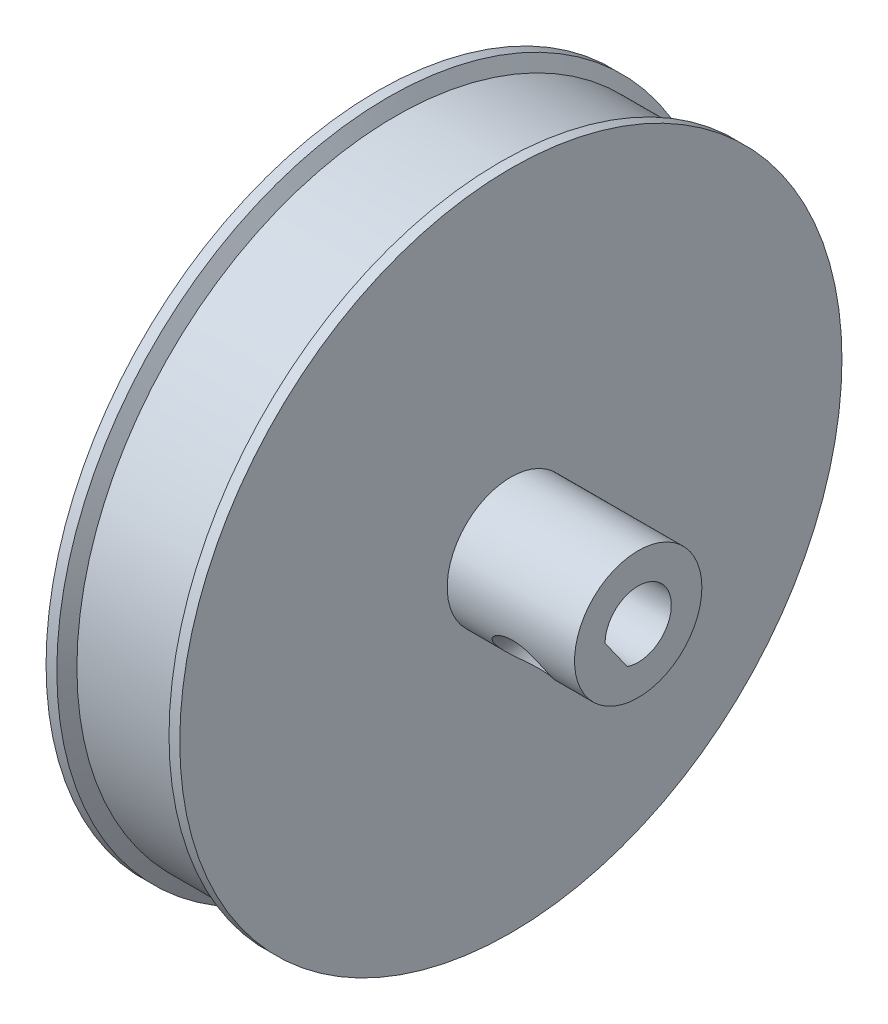
ISO-10303-21;
HEADER;
FILE_DESCRIPTION(('STEP AP214'),'2;1');
FILE_NAME('part.step','',(''),(''),'','','');
FILE_SCHEMA(('AUTOMOTIVE_DESIGN { 1 0 10303 214 1 1 1 1 }'));
ENDSEC;
DATA;
#1=APPLICATION_CONTEXT('core data for automotive mechanical design processes');
#2=APPLICATION_PROTOCOL_DEFINITION('international standard','automotive_design',2000,#1);
#3=PRODUCT_CONTEXT('',#1,'mechanical');
#4=PRODUCT('Part','Part','',(#3));
#5=PRODUCT_RELATED_PRODUCT_CATEGORY('part','',(#4));
#6=PRODUCT_DEFINITION_FORMATION('','',#4);
#7=PRODUCT_DEFINITION_CONTEXT('part definition',#1,'design');
#8=PRODUCT_DEFINITION('design','',#6,#7);
#9=PRODUCT_DEFINITION_SHAPE('','',#8);
#10=(LENGTH_UNIT() NAMED_UNIT(*) SI_UNIT(.MILLI.,.METRE.));
#11=(NAMED_UNIT(*) PLANE_ANGLE_UNIT() SI_UNIT($,.RADIAN.));
#12=(NAMED_UNIT(*) SI_UNIT($,.STERADIAN.) SOLID_ANGLE_UNIT());
#13=UNCERTAINTY_MEASURE_WITH_UNIT(LENGTH_MEASURE(1.E-05),#10,'distance_accuracy_value','');
#14=(GEOMETRIC_REPRESENTATION_CONTEXT(3) GLOBAL_UNCERTAINTY_ASSIGNED_CONTEXT((#13)) GLOBAL_UNIT_ASSIGNED_CONTEXT((#10,
#11,#12)) REPRESENTATION_CONTEXT('',''));
#15=CARTESIAN_POINT('',(0.,0.,0.));
#16=DIRECTION('',(0.,0.,1.));
#17=DIRECTION('',(1.,0.,0.));
#18=AXIS2_PLACEMENT_3D('',#15,#16,#17);
#19=CARTESIAN_POINT('',(-3.25,0.,0.));
#20=DIRECTION('',(1.,0.,0.));
#21=DIRECTION('',(0.,0.,-1.));
#22=AXIS2_PLACEMENT_3D('',#19,#20,#21);
#23=CYLINDRICAL_SURFACE('',#22,2.6);
#24=DIRECTION('',(1.,0.,0.));
#25=VECTOR('',#24,1.);
#26=CARTESIAN_POINT('',(-3.25,0.,2.6));
#27=LINE('',#26,#25);
#28=CARTESIAN_POINT('',(-5.25,0.,2.6));
#29=VERTEX_POINT('',#28);
#30=CARTESIAN_POINT('',(15.25,0.,2.6));
#31=VERTEX_POINT('',#30);
#32=EDGE_CURVE('E52',#29,#31,#27,.T.);
#33=ORIENTED_EDGE('',*,*,#32,.F.);
#34=CARTESIAN_POINT('',(-5.25,0.,0.));
#35=DIRECTION('',(-1.,0.,0.));
#36=DIRECTION('',(0.,0.,1.));
#37=AXIS2_PLACEMENT_3D('',#34,#35,#36);
#38=CIRCLE('',#37,2.6);
#39=CARTESIAN_POINT('',(-5.25,-2.45039545172254,0.869230769230768));
#40=VERTEX_POINT('',#39);
#41=EDGE_CURVE('E11',#29,#40,#38,.T.);
#42=ORIENTED_EDGE('',*,*,#41,.T.);
#43=DIRECTION('',(1.,0.,0.));
#44=VECTOR('',#43,1.);
#45=CARTESIAN_POINT('',(-3.25,-2.45039545172253,0.869230769230769));
#46=LINE('',#45,#44);
#47=CARTESIAN_POINT('',(15.25,-2.45039545172253,0.869230769230769));
#48=VERTEX_POINT('',#47);
#49=EDGE_CURVE('E48',#40,#48,#46,.T.);
#50=ORIENTED_EDGE('',*,*,#49,.T.);
#51=CARTESIAN_POINT('',(15.25,0.,0.));
#52=DIRECTION('',(1.,0.,0.));
#53=DIRECTION('',(0.,0.,-1.));
#54=AXIS2_PLACEMENT_3D('',#51,#52,#53);
#55=CIRCLE('',#54,2.6);
#56=EDGE_CURVE('E61',#48,#31,#55,.T.);
#57=ORIENTED_EDGE('',*,*,#56,.T.);
#58=EDGE_LOOP('',(#33,#42,#50,#57));
#59=FACE_BOUND('',#58,.T.);
#60=ADVANCED_FACE('F33',(#59),#23,.F.);
#61=CARTESIAN_POINT('',(-3.25,-2.45039545172253,0.869230769230769));
#62=DIRECTION('',(0.,-0.576923076923077,0.816798483907512));
#63=DIRECTION('',(0.,-0.816798483907512,-0.576923076923077));
#64=AXIS2_PLACEMENT_3D('',#61,#62,#63);
#65=PLANE('',#64);
#66=CARTESIAN_POINT('',(10.25,-1.22519772586127,1.73461538461538));
#67=DIRECTION('',(0.,-0.576923076923077,0.816798483907512));
#68=DIRECTION('',(0.,-0.816798483907512,-0.576923076923077));
#69=AXIS2_PLACEMENT_3D('',#66,#67,#68);
#70=CIRCLE('',#69,0.799999999999999);
#71=CARTESIAN_POINT('',(10.25,-1.87863651298728,1.27307692307692));
#72=VERTEX_POINT('',#71);
#73=EDGE_CURVE('E88',#72,#72,#70,.T.);
#74=ORIENTED_EDGE('',*,*,#73,.T.);
#75=EDGE_LOOP('',(#74));
#76=FACE_BOUND('',#75,.T.);
#77=ORIENTED_EDGE('',*,*,#49,.F.);
#78=DIRECTION('',(0.,0.816798483907512,0.576923076923077));
#79=VECTOR('',#78,1.);
#80=CARTESIAN_POINT('',(-5.25,-1.22519772586127,1.73461538461538));
#81=LINE('',#80,#79);
#82=EDGE_CURVE('E41',#40,#29,#81,.T.);
#83=ORIENTED_EDGE('',*,*,#82,.T.);
#84=ORIENTED_EDGE('',*,*,#32,.T.);
#85=DIRECTION('',(0.,-0.816798483907512,-0.576923076923077));
#86=VECTOR('',#85,1.);
#87=CARTESIAN_POINT('',(15.25,0.,2.6));
#88=LINE('',#87,#86);
#89=EDGE_CURVE('E90',#31,#48,#88,.T.);
#90=ORIENTED_EDGE('',*,*,#89,.T.);
#91=EDGE_LOOP('',(#77,#83,#84,#90));
#92=FACE_BOUND('',#91,.T.);
#93=ADVANCED_FACE('F65',(#76,#92),#65,.F.);
#94=CARTESIAN_POINT('',(5.25,0.,0.));
#95=DIRECTION('',(1.,0.,0.));
#96=DIRECTION('',(0.,0.,-1.));
#97=AXIS2_PLACEMENT_3D('',#94,#95,#96);
#98=PLANE('',#97);
#99=CARTESIAN_POINT('',(5.25,0.,0.));
#100=DIRECTION('',(1.,0.,0.));
#101=DIRECTION('',(0.,0.,-1.));
#102=AXIS2_PLACEMENT_3D('',#99,#100,#101);
#103=CIRCLE('',#102,26.);
#104=CARTESIAN_POINT('',(5.25,0.,-26.));
#105=VERTEX_POINT('',#104);
#106=EDGE_CURVE('E98',#105,#105,#103,.T.);
#107=ORIENTED_EDGE('',*,*,#106,.T.);
#108=EDGE_LOOP('',(#107));
#109=FACE_BOUND('',#108,.T.);
#110=CARTESIAN_POINT('',(5.25,0.,0.));
#111=DIRECTION('',(1.,0.,0.));
#112=DIRECTION('',(0.,0.,-1.));
#113=AXIS2_PLACEMENT_3D('',#110,#111,#112);
#114=CIRCLE('',#113,5.);
#115=CARTESIAN_POINT('',(5.25,0.,-5.));
#116=VERTEX_POINT('',#115);
#117=EDGE_CURVE('E92',#116,#116,#114,.T.);
#118=ORIENTED_EDGE('',*,*,#117,.F.);
#119=EDGE_LOOP('',(#118));
#120=FACE_BOUND('',#119,.T.);
#121=ADVANCED_FACE('F144',(#109,#120),#98,.T.);
#122=CARTESIAN_POINT('',(-3.25,0.,0.));
#123=DIRECTION('',(1.,0.,0.));
#124=DIRECTION('',(0.,0.,-1.));
#125=AXIS2_PLACEMENT_3D('',#122,#123,#124);
#126=CYLINDRICAL_SURFACE('',#125,25.);
#127=CARTESIAN_POINT('',(-3.82735026918964,0.,0.));
#128=DIRECTION('',(1.,0.,0.));
#129=DIRECTION('',(0.,0.,-1.));
#130=AXIS2_PLACEMENT_3D('',#127,#128,#129);
#131=CIRCLE('',#130,25.);
#132=CARTESIAN_POINT('',(-3.82735026918964,0.,-25.));
#133=VERTEX_POINT('',#132);
#134=EDGE_CURVE('E80',#133,#133,#131,.F.);
#135=CARTESIAN_POINT('',(3.82735026918964,0.,0.));
#136=DIRECTION('',(1.,0.,0.));
#137=DIRECTION('',(0.,0.,-1.));
#138=AXIS2_PLACEMENT_3D('',#135,#136,#137);
#139=CIRCLE('',#138,25.);
#140=CARTESIAN_POINT('',(3.82735026918964,0.,-25.));
#141=VERTEX_POINT('',#140);
#142=EDGE_CURVE('E67',#141,#141,#139,.F.);
#143=CARTESIAN_POINT('',(-3.82735026918964,0.,-25.));
#144=CARTESIAN_POINT('',(-3.74761380524819,0.,-25.));
#145=CARTESIAN_POINT('',(-3.66787734130674,0.,-25.));
#146=CARTESIAN_POINT('',(-3.50840441342384,0.,-25.));
#147=CARTESIAN_POINT('',(-3.42866794948239,0.,-25.));
#148=CARTESIAN_POINT('',(-3.26919502159948,0.,-25.));
#149=CARTESIAN_POINT('',(-3.18945855765803,0.,-25.));
#150=CARTESIAN_POINT('',(-3.02998562977513,0.,-25.));
#151=CARTESIAN_POINT('',(-2.95024916583368,0.,-25.));
#152=CARTESIAN_POINT('',(-2.79077623795078,0.,-25.));
#153=CARTESIAN_POINT('',(-2.71103977400933,0.,-25.));
#154=CARTESIAN_POINT('',(-2.55156684612643,0.,-25.));
#155=CARTESIAN_POINT('',(-2.47183038218498,0.,-25.));
#156=CARTESIAN_POINT('',(-2.31235745430207,0.,-25.));
#157=CARTESIAN_POINT('',(-2.23262099036062,0.,-25.));
#158=CARTESIAN_POINT('',(-2.07314806247772,0.,-25.));
#159=CARTESIAN_POINT('',(-1.99341159853627,0.,-25.));
#160=CARTESIAN_POINT('',(-1.83393867065337,0.,-25.));
#161=CARTESIAN_POINT('',(-1.75420220671192,0.,-25.));
#162=CARTESIAN_POINT('',(-1.59472927882902,0.,-25.));
#163=CARTESIAN_POINT('',(-1.51499281488757,0.,-25.));
#164=CARTESIAN_POINT('',(-1.35551988700466,0.,-25.));
#165=CARTESIAN_POINT('',(-1.27578342306321,0.,-25.));
#166=CARTESIAN_POINT('',(-1.11631049518031,0.,-25.));
#167=CARTESIAN_POINT('',(-1.03657403123886,0.,-25.));
#168=CARTESIAN_POINT('',(-0.877101103355959,0.,-25.));
#169=CARTESIAN_POINT('',(-0.797364639414509,0.,-25.));
#170=CARTESIAN_POINT('',(-0.637891711531607,0.,-25.));
#171=CARTESIAN_POINT('',(-0.558155247590156,0.,-25.));
#172=CARTESIAN_POINT('',(-0.398682319707255,0.,-25.));
#173=CARTESIAN_POINT('',(-0.318945855765804,0.,-25.));
#174=CARTESIAN_POINT('',(-0.159472927882902,0.,-25.));
#175=CARTESIAN_POINT('',(-0.0797364639414512,0.,-25.));
#176=CARTESIAN_POINT('',(0.0797364639414505,0.,-25.));
#177=CARTESIAN_POINT('',(0.159472927882901,0.,-25.));
#178=CARTESIAN_POINT('',(0.318945855765803,0.,-25.));
#179=CARTESIAN_POINT('',(0.398682319707254,0.,-25.));
#180=CARTESIAN_POINT('',(0.558155247590155,0.,-25.));
#181=CARTESIAN_POINT('',(0.637891711531606,0.,-25.));
#182=CARTESIAN_POINT('',(0.797364639414507,0.,-25.));
#183=CARTESIAN_POINT('',(0.877101103355958,0.,-25.));
#184=CARTESIAN_POINT('',(1.03657403123886,0.,-25.));
#185=CARTESIAN_POINT('',(1.11631049518031,0.,-25.));
#186=CARTESIAN_POINT('',(1.27578342306321,0.,-25.));
#187=CARTESIAN_POINT('',(1.35551988700466,0.,-25.));
#188=CARTESIAN_POINT('',(1.51499281488756,0.,-25.));
#189=CARTESIAN_POINT('',(1.59472927882902,0.,-25.));
#190=CARTESIAN_POINT('',(1.75420220671192,0.,-25.));
#191=CARTESIAN_POINT('',(1.83393867065337,0.,-25.));
#192=CARTESIAN_POINT('',(1.99341159853627,0.,-25.));
#193=CARTESIAN_POINT('',(2.07314806247772,0.,-25.));
#194=CARTESIAN_POINT('',(2.23262099036062,0.,-25.));
#195=CARTESIAN_POINT('',(2.31235745430207,0.,-25.));
#196=CARTESIAN_POINT('',(2.47183038218497,0.,-25.));
#197=CARTESIAN_POINT('',(2.55156684612643,0.,-25.));
#198=CARTESIAN_POINT('',(2.71103977400933,0.,-25.));
#199=CARTESIAN_POINT('',(2.79077623795078,0.,-25.));
#200=CARTESIAN_POINT('',(2.95024916583368,0.,-25.));
#201=CARTESIAN_POINT('',(3.02998562977513,0.,-25.));
#202=CARTESIAN_POINT('',(3.18945855765803,0.,-25.));
#203=CARTESIAN_POINT('',(3.26919502159948,0.,-25.));
#204=CARTESIAN_POINT('',(3.42866794948238,0.,-25.));
#205=CARTESIAN_POINT('',(3.50840441342384,0.,-25.));
#206=CARTESIAN_POINT('',(3.66787734130674,0.,-25.));
#207=CARTESIAN_POINT('',(3.74761380524819,0.,-25.));
#208=CARTESIAN_POINT('',(3.82735026918964,0.,-25.));
#209=B_SPLINE_CURVE_WITH_KNOTS('',3,(#143,#144,#145,#146,#147,#148,#149,#150,#151,#152,#153,
#154,#155,#156,#157,#158,#159,#160,#161,#162,#163,#164,#165,#166,#167,#168,#169,#170,#171,#172,
#173,#174,#175,#176,#177,#178,#179,#180,#181,#182,#183,#184,#185,#186,#187,#188,#189,#190,#191,
#192,#193,#194,#195,#196,#197,#198,#199,#200,#201,#202,#203,#204,#205,#206,#207,#208),
.UNSPECIFIED.,.F.,.F.,(4,2,2,2,2,2,2,2,2,2,2,2,2,2,2,2,2,2,2,2,2,2,2,2,2,2,2,2,2,2,2,2,4),(0.,
0.239209391824353,0.478418783648705,0.717628175473057,0.95683756729741,1.19604695912176,
1.43525635094611,1.67446574277047,1.91367513459482,2.15288452641917,2.39209391824352,
2.63130331006788,2.87051270189223,3.10972209371658,3.34893148554093,3.58814087736529,
3.82735026918964,4.06655966101399,4.30576905283834,4.5449784446627,4.78418783648705,
5.0233972283114,5.26260662013575,5.50181601196011,5.74102540378446,5.98023479560881,
6.21944418743316,6.45865357925751,6.69786297108187,6.93707236290622,7.17628175473057,
7.41549114655492,7.65470053837928),.UNSPECIFIED.);
#210=EDGE_CURVE('BSEAM135',#133,#141,#209,.T.);
#211=ORIENTED_EDGE('',*,*,#134,.F.);
#212=ORIENTED_EDGE('',*,*,#142,.T.);
#213=ORIENTED_EDGE('',*,*,#210,.T.);
#214=ORIENTED_EDGE('',*,*,#210,.F.);
#215=EDGE_LOOP('',(#211,#213,#212,#214));
#216=FACE_BOUND('',#215,.T.);
#217=ADVANCED_FACE('F135',(#216),#126,.T.);
#218=CARTESIAN_POINT('',(5.25,0.,0.));
#219=DIRECTION('',(-1.,0.,0.));
#220=DIRECTION('',(0.,0.,1.));
#221=AXIS2_PLACEMENT_3D('',#218,#219,#220);
#222=CYLINDRICAL_SURFACE('',#221,26.);
#223=CARTESIAN_POINT('',(4.40470053837927,0.,0.));
#224=DIRECTION('',(1.,0.,0.));
#225=DIRECTION('',(0.,0.,-1.));
#226=AXIS2_PLACEMENT_3D('',#223,#224,#225);
#227=CIRCLE('',#226,26.);
#228=CARTESIAN_POINT('',(4.40470053837927,0.,-26.));
#229=VERTEX_POINT('',#228);
#230=EDGE_CURVE('E109',#229,#229,#227,.T.);
#231=ORIENTED_EDGE('',*,*,#230,.T.);
#232=EDGE_LOOP('',(#231));
#233=FACE_BOUND('',#232,.T.);
#234=ORIENTED_EDGE('',*,*,#106,.F.);
#235=EDGE_LOOP('',(#234));
#236=FACE_BOUND('',#235,.T.);
#237=ADVANCED_FACE('F128',(#233,#236),#222,.T.);
#238=CARTESIAN_POINT('',(15.25,0.,0.));
#239=DIRECTION('',(1.,0.,0.));
#240=DIRECTION('',(0.,0.,-1.));
#241=AXIS2_PLACEMENT_3D('',#238,#239,#240);
#242=PLANE('',#241);
#243=CARTESIAN_POINT('',(15.25,0.,0.));
#244=DIRECTION('',(1.,0.,0.));
#245=DIRECTION('',(0.,0.,-1.));
#246=AXIS2_PLACEMENT_3D('',#243,#244,#245);
#247=CIRCLE('',#246,5.);
#248=CARTESIAN_POINT('',(15.25,0.,-5.));
#249=VERTEX_POINT('',#248);
#250=EDGE_CURVE('E63',#249,#249,#247,.T.);
#251=ORIENTED_EDGE('',*,*,#250,.T.);
#252=EDGE_LOOP('',(#251));
#253=FACE_BOUND('',#252,.T.);
#254=ORIENTED_EDGE('',*,*,#89,.F.);
#255=ORIENTED_EDGE('',*,*,#56,.F.);
#256=EDGE_LOOP('',(#254,#255));
#257=FACE_BOUND('',#256,.T.);
#258=ADVANCED_FACE('F126',(#253,#257),#242,.T.);
#259=CARTESIAN_POINT('',(15.25,0.,0.));
#260=DIRECTION('',(-1.,0.,0.));
#261=DIRECTION('',(0.,0.,1.));
#262=AXIS2_PLACEMENT_3D('',#259,#260,#261);
#263=CYLINDRICAL_SURFACE('',#262,5.);
#264=CARTESIAN_POINT('',(8.94414859613843,-3.96553531662124,3.04541126665864));
#265=CARTESIAN_POINT('',(8.84284625375276,-3.92526973026726,3.09784461359848));
#266=CARTESIAN_POINT('',(8.74665041923198,-3.87909697339447,3.15583479240154));
#267=CARTESIAN_POINT('',(8.56786733207601,-3.77399377758463,3.28079491307994));
#268=CARTESIAN_POINT('',(8.48528105112917,-3.71506242841017,3.34776549551521));
#269=CARTESIAN_POINT('',(8.35371418337194,-3.59792342934822,3.47284053244815));
#270=CARTESIAN_POINT('',(8.30132575594326,-3.54228211871936,3.52975724367155));
#271=CARTESIAN_POINT('',(8.20980588014393,-3.42285472337419,3.64567785205998));
#272=CARTESIAN_POINT('',(8.1706616848005,-3.35907655191909,3.70467968162515));
#273=CARTESIAN_POINT('',(8.10766905188448,-3.22368109124507,3.82308904413848));
#274=CARTESIAN_POINT('',(8.08393299189263,-3.15201057113535,3.88249643335815));
#275=CARTESIAN_POINT('',(8.05402469893131,-3.00313871488491,3.99875583460571));
#276=CARTESIAN_POINT('',(8.04784126996629,-2.92594093655721,4.05560945277371));
#277=CARTESIAN_POINT('',(8.05317383051586,-2.77814952879757,4.15800560351234));
#278=CARTESIAN_POINT('',(8.06268849242472,-2.70785072126411,4.20409135754902));
#279=CARTESIAN_POINT('',(8.09511088635928,-2.56731856800065,4.2913538321258));
#280=CARTESIAN_POINT('',(8.11801952111226,-2.49708522700255,4.33253022155921));
#281=CARTESIAN_POINT('',(8.17598574242927,-2.35855411258574,4.40948137084261));
#282=CARTESIAN_POINT('',(8.21106829585812,-2.29026063135243,4.44524481138815));
#283=CARTESIAN_POINT('',(8.29174404472393,-2.15734855080227,4.51124850741991));
#284=CARTESIAN_POINT('',(8.33734091970078,-2.09273124787516,4.54148682270513));
#285=CARTESIAN_POINT('',(8.44446949396239,-1.95961955385501,4.60064343432608));
#286=CARTESIAN_POINT('',(8.50734040832366,-1.89185813104053,4.62877788703081));
#287=CARTESIAN_POINT('',(8.64250448698617,-1.76394505702008,4.67902008353833));
#288=CARTESIAN_POINT('',(8.71480378921378,-1.70379841378466,4.7011238721093));
#289=CARTESIAN_POINT('',(8.88148416800947,-1.58146510808047,4.74383098295936));
#290=CARTESIAN_POINT('',(8.97745173484352,-1.52105843065361,4.76335303223131));
#291=CARTESIAN_POINT('',(9.17760540656271,-1.41368878385227,4.79631530897199));
#292=CARTESIAN_POINT('',(9.28179639389761,-1.36673387889001,4.80975189096131));
#293=CARTESIAN_POINT('',(9.51084835560727,-1.28194795760774,4.83309631124301));
#294=CARTESIAN_POINT('',(9.63658301132327,-1.2462552922954,4.84226619857091));
#295=CARTESIAN_POINT('',(9.89235827971712,-1.195028614202,4.85516299211019));
#296=CARTESIAN_POINT('',(10.0223993358791,-1.17949668428685,4.8588893359378));
#297=CARTESIAN_POINT('',(10.2878313613667,-1.16904416230067,4.86141706891306));
#298=CARTESIAN_POINT('',(10.4232532524279,-1.17484630261953,4.86004574789626));
#299=CARTESIAN_POINT('',(10.6911781122714,-1.20843741250213,4.85180056116464));
#300=CARTESIAN_POINT('',(10.8236807052695,-1.23622919586381,4.84492599125196));
#301=CARTESIAN_POINT('',(11.081979977196,-1.3126521378385,4.82477948265657));
#302=CARTESIAN_POINT('',(11.2077787479509,-1.36127675256121,4.81150955268461));
#303=CARTESIAN_POINT('',(11.4491506228132,-1.47774361823909,4.77702335465331));
#304=CARTESIAN_POINT('',(11.5647152531907,-1.54560160247539,4.75580057640778));
#305=CARTESIAN_POINT('',(11.7796646076641,-1.69720404980518,4.70380898742196));
#306=CARTESIAN_POINT('',(11.8792836063552,-1.78066971421268,4.67320244497986));
#307=CARTESIAN_POINT('',(12.0596356348946,-1.961592039387,4.60017220456813));
#308=CARTESIAN_POINT('',(12.1404185152914,-2.05901064283352,4.55778036484242));
#309=CARTESIAN_POINT('',(12.255174552387,-2.23078563888456,4.47543520350219));
#310=CARTESIAN_POINT('',(12.2958405671288,-2.30243731845141,4.43911081940339));
#311=CARTESIAN_POINT('',(12.3638902341633,-2.44856258178543,4.36020733565788));
#312=CARTESIAN_POINT('',(12.3912861803046,-2.52303348448542,4.31763407302736));
#313=CARTESIAN_POINT('',(12.4312220742302,-2.67290118989549,4.22650210095668));
#314=CARTESIAN_POINT('',(12.4436853819863,-2.74830077947737,4.17791391370633));
#315=CARTESIAN_POINT('',(12.4525846991196,-2.89697996330596,4.07622476573014));
#316=CARTESIAN_POINT('',(12.4490236275007,-2.97025994121403,4.02312462863079));
#317=CARTESIAN_POINT('',(12.4270977188367,-3.10644227959682,3.91877311473853));
#318=CARTESIAN_POINT('',(12.4099625985793,-3.16970371708535,3.86772357213372));
#319=CARTESIAN_POINT('',(12.363433247638,-3.29100448121444,3.76505112513287));
#320=CARTESIAN_POINT('',(12.3340368644131,-3.34904288874346,3.71342812161188));
#321=CARTESIAN_POINT('',(12.2627142841719,-3.46181093247826,3.60861289626759));
#322=CARTESIAN_POINT('',(12.2202424288052,-3.5162369597558,3.55546855702983));
#323=CARTESIAN_POINT('',(12.1251936260951,-3.61817158613689,3.45168598028309));
#324=CARTESIAN_POINT('',(12.0726121459471,-3.66567706544998,3.40104887978827));
#325=CARTESIAN_POINT('',(11.9496629581162,-3.76111747038132,3.29543087362051));
#326=CARTESIAN_POINT('',(11.8777923011206,-3.80783806207905,3.24110523330198));
#327=CARTESIAN_POINT('',(11.7248698567663,-3.89249615257863,3.13893026762325));
#328=CARTESIAN_POINT('',(11.6438116618749,-3.9304274647716,3.09108551381858));
#329=CARTESIAN_POINT('',(11.4586856938721,-4.00432305101703,2.99495123327787));
#330=CARTESIAN_POINT('',(11.3531373438668,-4.03862070154044,2.94822178812641));
#331=CARTESIAN_POINT('',(11.1345394547341,-4.09643678222325,2.86734694910753));
#332=CARTESIAN_POINT('',(11.021487002062,-4.11995099724707,2.83320647716197));
#333=CARTESIAN_POINT('',(10.7780180106719,-4.15874129666123,2.77600654059423));
#334=CARTESIAN_POINT('',(10.6470401741762,-4.17286219740914,2.75452983870511));
#335=CARTESIAN_POINT('',(10.3825849059119,-4.18897381126888,2.72996636329856));
#336=CARTESIAN_POINT('',(10.249106363793,-4.190959001456,2.72688796280599));
#337=CARTESIAN_POINT('',(9.9813524274109,-4.18278518580502,2.73940953104118));
#338=CARTESIAN_POINT('',(9.84709632544987,-4.17243902752201,2.75529735533668));
#339=CARTESIAN_POINT('',(9.58381035969653,-4.13899569932827,2.80528290212423));
#340=CARTESIAN_POINT('',(9.45477282890593,-4.11591802322592,2.83935278264232));
#341=CARTESIAN_POINT('',(9.2629182238128,-4.07007791443693,2.9043455085753));
#342=CARTESIAN_POINT('',(9.19693176594587,-4.05204879754166,2.92951342043038));
#343=CARTESIAN_POINT('',(9.06806110374705,-4.01190731260229,2.98425119039467));
#344=CARTESIAN_POINT('',(9.00517815768603,-3.98979330535841,3.01382281471516));
#345=CARTESIAN_POINT('',(8.94414859613843,-3.96553531662124,3.04541126665864));
#346=B_SPLINE_CURVE_WITH_KNOTS('',3,(#264,#265,#266,#267,#268,#269,#270,#271,#272,#273,#274,
#275,#276,#277,#278,#279,#280,#281,#282,#283,#284,#285,#286,#287,#288,#289,#290,#291,#292,#293,
#294,#295,#296,#297,#298,#299,#300,#301,#302,#303,#304,#305,#306,#307,#308,#309,#310,#311,#312,
#313,#314,#315,#316,#317,#318,#319,#320,#321,#322,#323,#324,#325,#326,#327,#328,#329,#330,#331,
#332,#333,#334,#335,#336,#337,#338,#339,#340,#341,#342,#343,#344,#345),.UNSPECIFIED.,.T.,.F.,(4,
2,2,2,2,2,2,2,2,2,2,2,2,2,2,2,2,2,2,2,2,2,2,2,2,2,2,2,2,2,2,2,2,2,2,2,2,2,2,2,4),(0.,
0.362651958749141,0.725329798740519,1.01006383632184,1.29452304553178,1.58103428698043,
1.86736273531021,2.11992392091748,2.37250213061158,2.62560143169093,2.87878944093167,
3.16758823640632,3.45657598872167,3.8004199486593,4.14446961564128,4.53576481090769,
4.92710042883526,5.33181354739167,5.73657846147493,6.1412163262175,6.54618615289328,
6.94451426537204,7.34177590780631,7.61081952831204,7.87961341853953,8.14978103220377,
8.41989943407844,8.66801097544164,8.91616609267592,9.17653944406926,9.43702981122182,
9.74036172023033,10.0439064946595,10.4036927815429,10.7636195856127,11.1621802512325,
11.5609222870957,11.9657938759116,12.3700472609955,12.5884389814305,12.8069185300334),.UNSPECIFIED.);
#347=CARTESIAN_POINT('',(8.94414859613843,-3.96553531662124,3.04541126665864));
#348=VERTEX_POINT('',#347);
#349=EDGE_CURVE('E101',#348,#348,#346,.T.);
#350=ORIENTED_EDGE('',*,*,#349,.T.);
#351=EDGE_LOOP('',(#350));
#352=FACE_BOUND('',#351,.T.);
#353=ORIENTED_EDGE('',*,*,#250,.F.);
#354=EDGE_LOOP('',(#353));
#355=FACE_BOUND('',#354,.T.);
#356=ORIENTED_EDGE('',*,*,#117,.T.);
#357=EDGE_LOOP('',(#356));
#358=FACE_BOUND('',#357,.T.);
#359=ADVANCED_FACE('F111',(#352,#355,#358),#263,.T.);
#360=CARTESIAN_POINT('',(10.25,-2.88461538461538,4.08399241953756));
#361=DIRECTION('',(0.,-0.576923076923077,0.816798483907512));
#362=DIRECTION('',(0.,-0.816798483907512,-0.576923076923077));
#363=AXIS2_PLACEMENT_3D('',#360,#361,#362);
#364=CYLINDRICAL_SURFACE('',#363,0.799999999999999);
#365=CARTESIAN_POINT('',(10.25,-2.07692307692308,2.94047454206704));
#366=DIRECTION('',(0.,-0.576923076923077,0.816798483907512));
#367=DIRECTION('',(0.,-0.816798483907512,-0.576923076923077));
#368=AXIS2_PLACEMENT_3D('',#365,#366,#367);
#369=CIRCLE('',#368,0.799999999999999);
#370=CARTESIAN_POINT('',(10.25,-2.73036186404908,2.47893608052858));
#371=VERTEX_POINT('',#370);
#372=EDGE_CURVE('E85',#371,#371,#369,.T.);
#373=ORIENTED_EDGE('',*,*,#372,.T.);
#374=EDGE_LOOP('',(#373));
#375=FACE_BOUND('',#374,.T.);
#376=ORIENTED_EDGE('',*,*,#73,.F.);
#377=EDGE_LOOP('',(#376));
#378=FACE_BOUND('',#377,.T.);
#379=ADVANCED_FACE('F120',(#375,#378),#364,.F.);
#380=CARTESIAN_POINT('',(10.25,-2.88461538461539,4.08399241953756));
#381=DIRECTION('',(0.,-0.576923076923077,0.816798483907512));
#382=DIRECTION('',(0.,-0.816798483907512,-0.576923076923077));
#383=AXIS2_PLACEMENT_3D('',#380,#381,#382);
#384=CONICAL_SURFACE('',#383,2.2,0.785398163397448);
#385=ORIENTED_EDGE('',*,*,#372,.F.);
#386=EDGE_LOOP('',(#385));
#387=FACE_BOUND('',#386,.T.);
#388=ORIENTED_EDGE('',*,*,#349,.F.);
#389=EDGE_LOOP('',(#388));
#390=FACE_BOUND('',#389,.T.);
#391=ADVANCED_FACE('F115',(#387,#390),#384,.F.);
#392=CARTESIAN_POINT('',(4.40470053837927,0.,0.));
#393=DIRECTION('',(1.,0.,0.));
#394=DIRECTION('',(0.,0.,-1.));
#395=AXIS2_PLACEMENT_3D('',#392,#393,#394);
#396=CONICAL_SURFACE('',#395,26.,1.04719755119659);
#397=ORIENTED_EDGE('',*,*,#142,.F.);
#398=EDGE_LOOP('',(#397));
#399=FACE_BOUND('',#398,.T.);
#400=ORIENTED_EDGE('',*,*,#230,.F.);
#401=EDGE_LOOP('',(#400));
#402=FACE_BOUND('',#401,.T.);
#403=ADVANCED_FACE('F35',(#399,#402),#396,.T.);
#404=CARTESIAN_POINT('',(-4.40470053837927,0.,0.));
#405=DIRECTION('',(-1.,0.,0.));
#406=DIRECTION('',(0.,0.,-1.));
#407=AXIS2_PLACEMENT_3D('',#404,#405,#406);
#408=CONICAL_SURFACE('',#407,26.,1.04719755119659);
#409=ORIENTED_EDGE('',*,*,#134,.T.);
#410=EDGE_LOOP('',(#409));
#411=FACE_BOUND('',#410,.T.);
#412=CARTESIAN_POINT('',(-4.40470053837927,0.,0.));
#413=DIRECTION('',(1.,0.,0.));
#414=DIRECTION('',(0.,0.,-1.));
#415=AXIS2_PLACEMENT_3D('',#412,#413,#414);
#416=CIRCLE('',#415,26.);
#417=CARTESIAN_POINT('',(-4.40470053837927,0.,-26.));
#418=VERTEX_POINT('',#417);
#419=EDGE_CURVE('E77',#418,#418,#416,.T.);
#420=ORIENTED_EDGE('',*,*,#419,.T.);
#421=EDGE_LOOP('',(#420));
#422=FACE_BOUND('',#421,.T.);
#423=ADVANCED_FACE('F122',(#411,#422),#408,.T.);
#424=CARTESIAN_POINT('',(-5.25,0.,0.));
#425=DIRECTION('',(1.,0.,0.));
#426=DIRECTION('',(0.,0.,1.));
#427=AXIS2_PLACEMENT_3D('',#424,#425,#426);
#428=CYLINDRICAL_SURFACE('',#427,26.);
#429=ORIENTED_EDGE('',*,*,#419,.F.);
#430=EDGE_LOOP('',(#429));
#431=FACE_BOUND('',#430,.T.);
#432=CARTESIAN_POINT('',(-5.25,0.,0.));
#433=DIRECTION('',(1.,0.,0.));
#434=DIRECTION('',(0.,0.,-1.));
#435=AXIS2_PLACEMENT_3D('',#432,#433,#434);
#436=CIRCLE('',#435,26.);
#437=CARTESIAN_POINT('',(-5.25,0.,-26.));
#438=VERTEX_POINT('',#437);
#439=EDGE_CURVE('E75',#438,#438,#436,.T.);
#440=ORIENTED_EDGE('',*,*,#439,.T.);
#441=EDGE_LOOP('',(#440));
#442=FACE_BOUND('',#441,.T.);
#443=ADVANCED_FACE('F71',(#431,#442),#428,.T.);
#444=CARTESIAN_POINT('',(-5.25,0.,0.));
#445=DIRECTION('',(-1.,0.,0.));
#446=DIRECTION('',(0.,0.,-1.));
#447=AXIS2_PLACEMENT_3D('',#444,#445,#446);
#448=PLANE('',#447);
#449=ORIENTED_EDGE('',*,*,#41,.F.);
#450=ORIENTED_EDGE('',*,*,#82,.F.);
#451=EDGE_LOOP('',(#449,#450));
#452=FACE_BOUND('',#451,.T.);
#453=ORIENTED_EDGE('',*,*,#439,.F.);
#454=EDGE_LOOP('',(#453));
#455=FACE_BOUND('',#454,.T.);
#456=ADVANCED_FACE('F68',(#452,#455),#448,.T.);
#457=CLOSED_SHELL('',(#60,#93,#121,#217,#237,#258,#359,#379,#391,#403,#423,#443,#456));
#458=MANIFOLD_SOLID_BREP('B2',#457);
#459=ADVANCED_BREP_SHAPE_REPRESENTATION('',(#18,#458),#14);
#460=SHAPE_DEFINITION_REPRESENTATION(#9,#459);
ENDSEC;
END-ISO-10303-21;
